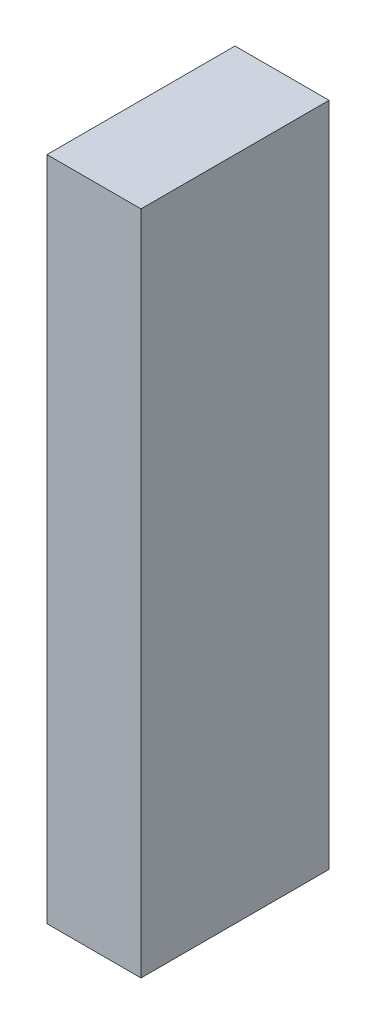
ISO-10303-21;
HEADER;
FILE_DESCRIPTION(('STEP AP214'),'2;1');
FILE_NAME('part.step','',(''),(''),'','','');
FILE_SCHEMA(('AUTOMOTIVE_DESIGN { 1 0 10303 214 1 1 1 1 }'));
ENDSEC;
DATA;
#1=APPLICATION_CONTEXT('core data for automotive mechanical design processes');
#2=APPLICATION_PROTOCOL_DEFINITION('international standard','automotive_design',2000,#1);
#3=PRODUCT_CONTEXT('',#1,'mechanical');
#4=PRODUCT('Part','Part','',(#3));
#5=PRODUCT_RELATED_PRODUCT_CATEGORY('part','',(#4));
#6=PRODUCT_DEFINITION_FORMATION('','',#4);
#7=PRODUCT_DEFINITION_CONTEXT('part definition',#1,'design');
#8=PRODUCT_DEFINITION('design','',#6,#7);
#9=PRODUCT_DEFINITION_SHAPE('','',#8);
#10=(LENGTH_UNIT() NAMED_UNIT(*) SI_UNIT(.MILLI.,.METRE.));
#11=(NAMED_UNIT(*) PLANE_ANGLE_UNIT() SI_UNIT($,.RADIAN.));
#12=(NAMED_UNIT(*) SI_UNIT($,.STERADIAN.) SOLID_ANGLE_UNIT());
#13=UNCERTAINTY_MEASURE_WITH_UNIT(LENGTH_MEASURE(1.E-05),#10,'distance_accuracy_value','');
#14=(GEOMETRIC_REPRESENTATION_CONTEXT(3) GLOBAL_UNCERTAINTY_ASSIGNED_CONTEXT((#13)) GLOBAL_UNIT_ASSIGNED_CONTEXT((#10,
#11,#12)) REPRESENTATION_CONTEXT('',''));
#15=CARTESIAN_POINT('',(0.,0.,0.));
#16=DIRECTION('',(0.,0.,1.));
#17=DIRECTION('',(1.,0.,0.));
#18=AXIS2_PLACEMENT_3D('',#15,#16,#17);
#19=CARTESIAN_POINT('',(55.,42.5,54.));
#20=DIRECTION('',(1.,0.,0.));
#21=DIRECTION('',(0.,0.,-1.));
#22=AXIS2_PLACEMENT_3D('',#19,#20,#21);
#23=PLANE('',#22);
#24=DIRECTION('',(0.,-1.,0.));
#25=VECTOR('',#24,1.);
#26=CARTESIAN_POINT('',(55.,42.5,30.));
#27=LINE('',#26,#25);
#28=CARTESIAN_POINT('',(55.,42.5,30.));
#29=VERTEX_POINT('',#28);
#30=CARTESIAN_POINT('',(55.,-42.5,30.));
#31=VERTEX_POINT('',#30);
#32=EDGE_CURVE('E105',#29,#31,#27,.T.);
#33=ORIENTED_EDGE('',*,*,#32,.T.);
#34=DIRECTION('',(0.,0.,-1.));
#35=VECTOR('',#34,1.);
#36=CARTESIAN_POINT('',(55.,-42.5,54.));
#37=LINE('',#36,#35);
#38=CARTESIAN_POINT('',(55.,-42.5,54.));
#39=VERTEX_POINT('',#38);
#40=EDGE_CURVE('E11',#39,#31,#37,.T.);
#41=ORIENTED_EDGE('',*,*,#40,.F.);
#42=DIRECTION('',(0.,-1.,0.));
#43=VECTOR('',#42,1.);
#44=CARTESIAN_POINT('',(55.,42.5,54.));
#45=LINE('',#44,#43);
#46=CARTESIAN_POINT('',(55.,42.5,54.));
#47=VERTEX_POINT('',#46);
#48=EDGE_CURVE('E89',#47,#39,#45,.T.);
#49=ORIENTED_EDGE('',*,*,#48,.F.);
#50=DIRECTION('',(0.,0.,-1.));
#51=VECTOR('',#50,1.);
#52=CARTESIAN_POINT('',(55.,42.5,54.));
#53=LINE('',#52,#51);
#54=EDGE_CURVE('E97',#47,#29,#53,.T.);
#55=ORIENTED_EDGE('',*,*,#54,.T.);
#56=EDGE_LOOP('',(#33,#41,#49,#55));
#57=FACE_BOUND('',#56,.T.);
#58=ADVANCED_FACE('F39',(#57),#23,.F.);
#59=CARTESIAN_POINT('',(55.,-42.5,54.));
#60=DIRECTION('',(0.,1.,0.));
#61=DIRECTION('',(0.,0.,1.));
#62=AXIS2_PLACEMENT_3D('',#59,#60,#61);
#63=PLANE('',#62);
#64=DIRECTION('',(1.,0.,0.));
#65=VECTOR('',#64,1.);
#66=CARTESIAN_POINT('',(55.,-42.5,30.));
#67=LINE('',#66,#65);
#68=CARTESIAN_POINT('',(67.,-42.5,30.));
#69=VERTEX_POINT('',#68);
#70=EDGE_CURVE('E92',#31,#69,#67,.T.);
#71=ORIENTED_EDGE('',*,*,#70,.T.);
#72=DIRECTION('',(0.,0.,-1.));
#73=VECTOR('',#72,1.);
#74=CARTESIAN_POINT('',(67.,-42.5,54.));
#75=LINE('',#74,#73);
#76=CARTESIAN_POINT('',(67.,-42.5,54.));
#77=VERTEX_POINT('',#76);
#78=EDGE_CURVE('E50',#77,#69,#75,.T.);
#79=ORIENTED_EDGE('',*,*,#78,.F.);
#80=DIRECTION('',(1.,0.,0.));
#81=VECTOR('',#80,1.);
#82=CARTESIAN_POINT('',(55.,-42.5,54.));
#83=LINE('',#82,#81);
#84=EDGE_CURVE('E82',#39,#77,#83,.T.);
#85=ORIENTED_EDGE('',*,*,#84,.F.);
#86=ORIENTED_EDGE('',*,*,#40,.T.);
#87=EDGE_LOOP('',(#71,#79,#85,#86));
#88=FACE_BOUND('',#87,.T.);
#89=ADVANCED_FACE('F93',(#88),#63,.F.);
#90=CARTESIAN_POINT('',(67.,-42.5,54.));
#91=DIRECTION('',(-1.,0.,0.));
#92=DIRECTION('',(0.,0.,1.));
#93=AXIS2_PLACEMENT_3D('',#90,#91,#92);
#94=PLANE('',#93);
#95=DIRECTION('',(0.,1.,0.));
#96=VECTOR('',#95,1.);
#97=CARTESIAN_POINT('',(67.,-42.5,30.));
#98=LINE('',#97,#96);
#99=CARTESIAN_POINT('',(67.,42.5,30.));
#100=VERTEX_POINT('',#99);
#101=EDGE_CURVE('E74',#69,#100,#98,.T.);
#102=ORIENTED_EDGE('',*,*,#101,.T.);
#103=DIRECTION('',(0.,0.,-1.));
#104=VECTOR('',#103,1.);
#105=CARTESIAN_POINT('',(67.,42.5,54.));
#106=LINE('',#105,#104);
#107=CARTESIAN_POINT('',(67.,42.5,54.));
#108=VERTEX_POINT('',#107);
#109=EDGE_CURVE('E94',#108,#100,#106,.T.);
#110=ORIENTED_EDGE('',*,*,#109,.F.);
#111=DIRECTION('',(0.,1.,0.));
#112=VECTOR('',#111,1.);
#113=CARTESIAN_POINT('',(67.,-42.5,54.));
#114=LINE('',#113,#112);
#115=EDGE_CURVE('E88',#77,#108,#114,.T.);
#116=ORIENTED_EDGE('',*,*,#115,.F.);
#117=ORIENTED_EDGE('',*,*,#78,.T.);
#118=EDGE_LOOP('',(#102,#110,#116,#117));
#119=FACE_BOUND('',#118,.T.);
#120=ADVANCED_FACE('F96',(#119),#94,.F.);
#121=CARTESIAN_POINT('',(67.,42.5,54.));
#122=DIRECTION('',(0.,-1.,0.));
#123=DIRECTION('',(0.,0.,-1.));
#124=AXIS2_PLACEMENT_3D('',#121,#122,#123);
#125=PLANE('',#124);
#126=DIRECTION('',(-1.,0.,0.));
#127=VECTOR('',#126,1.);
#128=CARTESIAN_POINT('',(67.,42.5,30.));
#129=LINE('',#128,#127);
#130=EDGE_CURVE('E76',#100,#29,#129,.T.);
#131=ORIENTED_EDGE('',*,*,#130,.T.);
#132=ORIENTED_EDGE('',*,*,#54,.F.);
#133=DIRECTION('',(-1.,0.,0.));
#134=VECTOR('',#133,1.);
#135=CARTESIAN_POINT('',(67.,42.5,54.));
#136=LINE('',#135,#134);
#137=EDGE_CURVE('E54',#108,#47,#136,.T.);
#138=ORIENTED_EDGE('',*,*,#137,.F.);
#139=ORIENTED_EDGE('',*,*,#109,.T.);
#140=EDGE_LOOP('',(#131,#132,#138,#139));
#141=FACE_BOUND('',#140,.T.);
#142=ADVANCED_FACE('F106',(#141),#125,.F.);
#143=CARTESIAN_POINT('',(0.,0.,54.));
#144=DIRECTION('',(0.,0.,1.));
#145=DIRECTION('',(1.,0.,0.));
#146=AXIS2_PLACEMENT_3D('',#143,#144,#145);
#147=PLANE('',#146);
#148=ORIENTED_EDGE('',*,*,#48,.T.);
#149=ORIENTED_EDGE('',*,*,#84,.T.);
#150=ORIENTED_EDGE('',*,*,#115,.T.);
#151=ORIENTED_EDGE('',*,*,#137,.T.);
#152=EDGE_LOOP('',(#148,#149,#150,#151));
#153=FACE_BOUND('',#152,.T.);
#154=ADVANCED_FACE('F86',(#153),#147,.T.);
#155=CARTESIAN_POINT('',(0.,0.,30.));
#156=DIRECTION('',(0.,0.,1.));
#157=DIRECTION('',(1.,0.,0.));
#158=AXIS2_PLACEMENT_3D('',#155,#156,#157);
#159=PLANE('',#158);
#160=ORIENTED_EDGE('',*,*,#32,.F.);
#161=ORIENTED_EDGE('',*,*,#130,.F.);
#162=ORIENTED_EDGE('',*,*,#101,.F.);
#163=ORIENTED_EDGE('',*,*,#70,.F.);
#164=EDGE_LOOP('',(#160,#161,#162,#163));
#165=FACE_BOUND('',#164,.T.);
#166=ADVANCED_FACE('F115',(#165),#159,.F.);
#167=CLOSED_SHELL('',(#58,#89,#120,#142,#154,#166));
#168=MANIFOLD_SOLID_BREP('B2',#167);
#169=ADVANCED_BREP_SHAPE_REPRESENTATION('',(#18,#168),#14);
#170=SHAPE_DEFINITION_REPRESENTATION(#9,#169);
ENDSEC;
END-ISO-10303-21;
